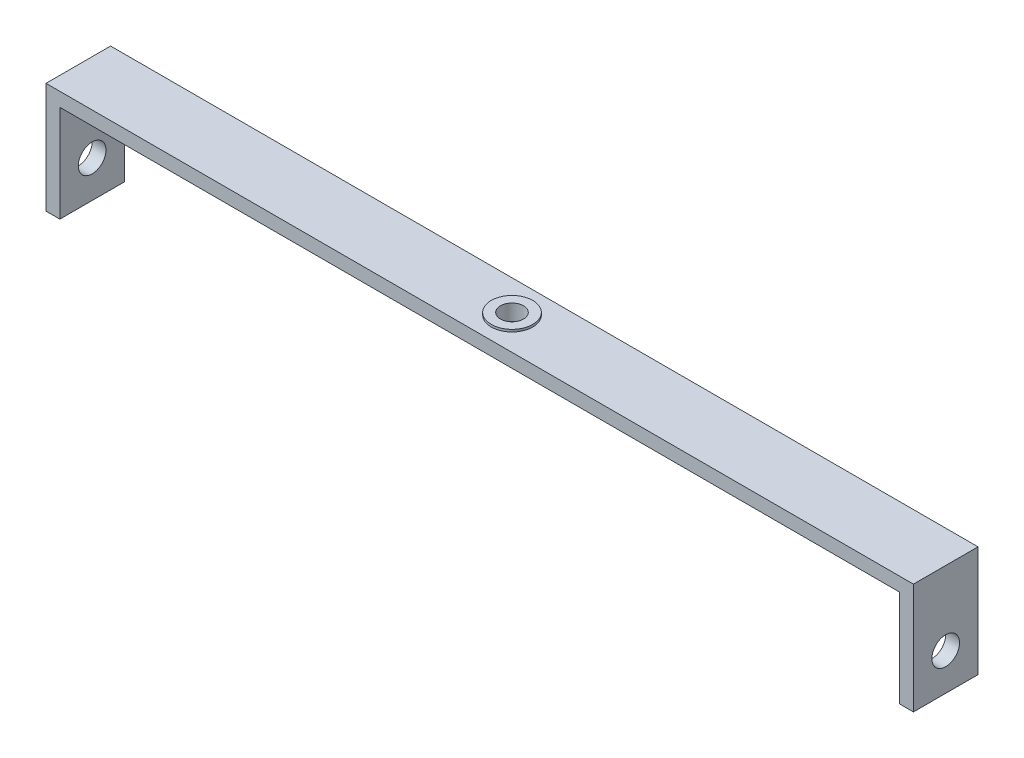
ISO-10303-21;
HEADER;
FILE_DESCRIPTION(('STEP AP214'),'2;1');
FILE_NAME('part.step','',(''),(''),'','','');
FILE_SCHEMA(('AUTOMOTIVE_DESIGN { 1 0 10303 214 1 1 1 1 }'));
ENDSEC;
DATA;
#1=APPLICATION_CONTEXT('core data for automotive mechanical design processes');
#2=APPLICATION_PROTOCOL_DEFINITION('international standard','automotive_design',2000,#1);
#3=PRODUCT_CONTEXT('',#1,'mechanical');
#4=PRODUCT('Part','Part','',(#3));
#5=PRODUCT_RELATED_PRODUCT_CATEGORY('part','',(#4));
#6=PRODUCT_DEFINITION_FORMATION('','',#4);
#7=PRODUCT_DEFINITION_CONTEXT('part definition',#1,'design');
#8=PRODUCT_DEFINITION('design','',#6,#7);
#9=PRODUCT_DEFINITION_SHAPE('','',#8);
#10=(LENGTH_UNIT() NAMED_UNIT(*) SI_UNIT(.MILLI.,.METRE.));
#11=(NAMED_UNIT(*) PLANE_ANGLE_UNIT() SI_UNIT($,.RADIAN.));
#12=(NAMED_UNIT(*) SI_UNIT($,.STERADIAN.) SOLID_ANGLE_UNIT());
#13=UNCERTAINTY_MEASURE_WITH_UNIT(LENGTH_MEASURE(1.E-05),#10,'distance_accuracy_value','');
#14=(GEOMETRIC_REPRESENTATION_CONTEXT(3) GLOBAL_UNCERTAINTY_ASSIGNED_CONTEXT((#13)) GLOBAL_UNIT_ASSIGNED_CONTEXT((#10,
#11,#12)) REPRESENTATION_CONTEXT('',''));
#15=CARTESIAN_POINT('',(0.,0.,0.));
#16=DIRECTION('',(0.,0.,1.));
#17=DIRECTION('',(1.,0.,0.));
#18=AXIS2_PLACEMENT_3D('',#15,#16,#17);
#19=CARTESIAN_POINT('',(-846.000000000001,29.5366942623952,63.));
#20=DIRECTION('',(0.,-1.,0.));
#21=DIRECTION('',(1.,0.,0.));
#22=AXIS2_PLACEMENT_3D('',#19,#20,#21);
#23=PLANE('',#22);
#24=DIRECTION('',(-1.,0.,0.));
#25=VECTOR('',#24,1.);
#26=CARTESIAN_POINT('',(-846.000000000001,29.5366942623952,-63.));
#27=LINE('',#26,#25);
#28=CARTESIAN_POINT('',(845.999999999999,29.5366942623955,-63.));
#29=VERTEX_POINT('',#28);
#30=CARTESIAN_POINT('',(-846.000000000001,29.5366942623952,-63.));
#31=VERTEX_POINT('',#30);
#32=EDGE_CURVE('E89',#29,#31,#27,.T.);
#33=ORIENTED_EDGE('',*,*,#32,.T.);
#34=DIRECTION('',(0.,0.,-1.));
#35=VECTOR('',#34,1.);
#36=CARTESIAN_POINT('',(-846.000000000001,29.5366942623952,63.));
#37=LINE('',#36,#35);
#38=CARTESIAN_POINT('',(-846.000000000001,29.5366942623952,63.));
#39=VERTEX_POINT('',#38);
#40=EDGE_CURVE('E135',#39,#31,#37,.T.);
#41=ORIENTED_EDGE('',*,*,#40,.F.);
#42=DIRECTION('',(-1.,0.,0.));
#43=VECTOR('',#42,1.);
#44=CARTESIAN_POINT('',(-846.000000000001,29.5366942623952,63.));
#45=LINE('',#44,#43);
#46=CARTESIAN_POINT('',(845.999999999999,29.5366942623955,63.));
#47=VERTEX_POINT('',#46);
#48=EDGE_CURVE('E121',#47,#39,#45,.T.);
#49=ORIENTED_EDGE('',*,*,#48,.F.);
#50=DIRECTION('',(0.,0.,-1.));
#51=VECTOR('',#50,1.);
#52=CARTESIAN_POINT('',(845.999999999999,29.5366942623955,63.));
#53=LINE('',#52,#51);
#54=EDGE_CURVE('E129',#47,#29,#53,.T.);
#55=ORIENTED_EDGE('',*,*,#54,.T.);
#56=EDGE_LOOP('',(#33,#41,#49,#55));
#57=FACE_BOUND('',#56,.T.);
#58=CARTESIAN_POINT('',(-1.3087115506199E-12,29.5366942623953,0.));
#59=DIRECTION('',(0.,-1.,0.));
#60=DIRECTION('',(1.,0.,0.));
#61=AXIS2_PLACEMENT_3D('',#58,#59,#60);
#62=CIRCLE('',#61,40.5);
#63=CARTESIAN_POINT('',(40.4999999999987,29.5366942623953,0.));
#64=VERTEX_POINT('',#63);
#65=EDGE_CURVE('E11',#64,#64,#62,.F.);
#66=ORIENTED_EDGE('',*,*,#65,.F.);
#67=EDGE_LOOP('',(#66));
#68=FACE_BOUND('',#67,.T.);
#69=ADVANCED_FACE('F42',(#57,#68),#23,.F.);
#70=CARTESIAN_POINT('',(-846.000000000001,-186.463305737605,63.));
#71=DIRECTION('',(0.,1.,0.));
#72=DIRECTION('',(0.,0.,1.));
#73=AXIS2_PLACEMENT_3D('',#70,#71,#72);
#74=PLANE('',#73);
#75=DIRECTION('',(1.,0.,0.));
#76=VECTOR('',#75,1.);
#77=CARTESIAN_POINT('',(-846.000000000001,-186.463305737605,-63.));
#78=LINE('',#77,#76);
#79=CARTESIAN_POINT('',(-846.000000000001,-186.463305737605,-63.));
#80=VERTEX_POINT('',#79);
#81=CARTESIAN_POINT('',(-819.000000000001,-186.463305737605,-63.));
#82=VERTEX_POINT('',#81);
#83=EDGE_CURVE('E145',#80,#82,#78,.T.);
#84=ORIENTED_EDGE('',*,*,#83,.T.);
#85=DIRECTION('',(0.,0.,-1.));
#86=VECTOR('',#85,1.);
#87=CARTESIAN_POINT('',(-819.000000000001,-186.463305737605,63.));
#88=LINE('',#87,#86);
#89=CARTESIAN_POINT('',(-819.000000000001,-186.463305737605,63.));
#90=VERTEX_POINT('',#89);
#91=EDGE_CURVE('E52',#90,#82,#88,.T.);
#92=ORIENTED_EDGE('',*,*,#91,.F.);
#93=DIRECTION('',(1.,0.,0.));
#94=VECTOR('',#93,1.);
#95=CARTESIAN_POINT('',(-846.000000000001,-186.463305737605,63.));
#96=LINE('',#95,#94);
#97=CARTESIAN_POINT('',(-846.000000000001,-186.463305737605,63.));
#98=VERTEX_POINT('',#97);
#99=EDGE_CURVE('E168',#98,#90,#96,.T.);
#100=ORIENTED_EDGE('',*,*,#99,.F.);
#101=DIRECTION('',(0.,0.,-1.));
#102=VECTOR('',#101,1.);
#103=CARTESIAN_POINT('',(-846.000000000001,-186.463305737605,63.));
#104=LINE('',#103,#102);
#105=EDGE_CURVE('E141',#98,#80,#104,.T.);
#106=ORIENTED_EDGE('',*,*,#105,.T.);
#107=EDGE_LOOP('',(#84,#92,#100,#106));
#108=FACE_BOUND('',#107,.T.);
#109=ADVANCED_FACE('F44',(#108),#74,.F.);
#110=CARTESIAN_POINT('',(-819.000000000001,-186.463305737605,63.));
#111=DIRECTION('',(-1.,0.,0.));
#112=DIRECTION('',(0.,0.,1.));
#113=AXIS2_PLACEMENT_3D('',#110,#111,#112);
#114=PLANE('',#113);
#115=CARTESIAN_POINT('',(-819.000000000001,-114.463305737605,0.));
#116=DIRECTION('',(-1.,0.,0.));
#117=DIRECTION('',(0.,0.,1.));
#118=AXIS2_PLACEMENT_3D('',#115,#116,#117);
#119=CIRCLE('',#118,27.);
#120=CARTESIAN_POINT('',(-819.000000000001,-114.463305737605,27.));
#121=VERTEX_POINT('',#120);
#122=EDGE_CURVE('E228',#121,#121,#119,.T.);
#123=ORIENTED_EDGE('',*,*,#122,.T.);
#124=EDGE_LOOP('',(#123));
#125=FACE_BOUND('',#124,.T.);
#126=DIRECTION('',(0.,1.,0.));
#127=VECTOR('',#126,1.);
#128=CARTESIAN_POINT('',(-819.000000000001,-186.463305737605,-63.));
#129=LINE('',#128,#127);
#130=CARTESIAN_POINT('',(-819.000000000001,2.53669426239516,-63.));
#131=VERTEX_POINT('',#130);
#132=EDGE_CURVE('E149',#82,#131,#129,.T.);
#133=ORIENTED_EDGE('',*,*,#132,.T.);
#134=DIRECTION('',(0.,0.,-1.));
#135=VECTOR('',#134,1.);
#136=CARTESIAN_POINT('',(-819.000000000001,2.53669426239516,63.));
#137=LINE('',#136,#135);
#138=CARTESIAN_POINT('',(-819.000000000001,2.53669426239516,63.));
#139=VERTEX_POINT('',#138);
#140=EDGE_CURVE('E183',#139,#131,#137,.T.);
#141=ORIENTED_EDGE('',*,*,#140,.F.);
#142=DIRECTION('',(0.,1.,0.));
#143=VECTOR('',#142,1.);
#144=CARTESIAN_POINT('',(-819.000000000001,-186.463305737605,63.));
#145=LINE('',#144,#143);
#146=EDGE_CURVE('E104',#90,#139,#145,.T.);
#147=ORIENTED_EDGE('',*,*,#146,.F.);
#148=ORIENTED_EDGE('',*,*,#91,.T.);
#149=EDGE_LOOP('',(#133,#141,#147,#148));
#150=FACE_BOUND('',#149,.T.);
#151=ADVANCED_FACE('F188',(#125,#150),#114,.F.);
#152=CARTESIAN_POINT('',(-819.000000000001,2.53669426239516,63.));
#153=DIRECTION('',(0.,1.,0.));
#154=DIRECTION('',(0.,0.,1.));
#155=AXIS2_PLACEMENT_3D('',#152,#153,#154);
#156=PLANE('',#155);
#157=CARTESIAN_POINT('',(-1.30329675274142E-12,2.53669426239516,0.));
#158=DIRECTION('',(0.,1.,0.));
#159=DIRECTION('',(0.,0.,1.));
#160=AXIS2_PLACEMENT_3D('',#157,#158,#159);
#161=CIRCLE('',#160,22.5);
#162=CARTESIAN_POINT('',(-1.30329675274142E-12,2.53669426239516,22.5));
#163=VERTEX_POINT('',#162);
#164=EDGE_CURVE('E150',#163,#163,#161,.F.);
#165=ORIENTED_EDGE('',*,*,#164,.F.);
#166=EDGE_LOOP('',(#165));
#167=FACE_BOUND('',#166,.T.);
#168=DIRECTION('',(1.,0.,0.));
#169=VECTOR('',#168,1.);
#170=CARTESIAN_POINT('',(-819.000000000001,2.53669426239516,-63.));
#171=LINE('',#170,#169);
#172=CARTESIAN_POINT('',(818.999999999999,2.53669426239516,-63.));
#173=VERTEX_POINT('',#172);
#174=EDGE_CURVE('E153',#131,#173,#171,.T.);
#175=ORIENTED_EDGE('',*,*,#174,.T.);
#176=DIRECTION('',(0.,0.,-1.));
#177=VECTOR('',#176,1.);
#178=CARTESIAN_POINT('',(818.999999999999,2.53669426239516,63.));
#179=LINE('',#178,#177);
#180=CARTESIAN_POINT('',(818.999999999999,2.53669426239516,63.));
#181=VERTEX_POINT('',#180);
#182=EDGE_CURVE('E179',#181,#173,#179,.T.);
#183=ORIENTED_EDGE('',*,*,#182,.F.);
#184=DIRECTION('',(1.,0.,0.));
#185=VECTOR('',#184,1.);
#186=CARTESIAN_POINT('',(-819.000000000001,2.53669426239516,63.));
#187=LINE('',#186,#185);
#188=EDGE_CURVE('E207',#139,#181,#187,.T.);
#189=ORIENTED_EDGE('',*,*,#188,.F.);
#190=ORIENTED_EDGE('',*,*,#140,.T.);
#191=EDGE_LOOP('',(#175,#183,#189,#190));
#192=FACE_BOUND('',#191,.T.);
#193=ADVANCED_FACE('F199',(#167,#192),#156,.F.);
#194=CARTESIAN_POINT('',(818.999999999999,2.53669426239516,63.));
#195=DIRECTION('',(1.,0.,0.));
#196=DIRECTION('',(0.,0.,-1.));
#197=AXIS2_PLACEMENT_3D('',#194,#195,#196);
#198=PLANE('',#197);
#199=CARTESIAN_POINT('',(818.999999999999,-114.463305737605,0.));
#200=DIRECTION('',(1.,0.,0.));
#201=DIRECTION('',(0.,0.,-1.));
#202=AXIS2_PLACEMENT_3D('',#199,#200,#201);
#203=CIRCLE('',#202,27.);
#204=CARTESIAN_POINT('',(818.999999999999,-114.463305737605,-27.));
#205=VERTEX_POINT('',#204);
#206=EDGE_CURVE('E232',#205,#205,#203,.T.);
#207=ORIENTED_EDGE('',*,*,#206,.T.);
#208=EDGE_LOOP('',(#207));
#209=FACE_BOUND('',#208,.T.);
#210=DIRECTION('',(0.,-1.,0.));
#211=VECTOR('',#210,1.);
#212=CARTESIAN_POINT('',(818.999999999999,2.53669426239516,-63.));
#213=LINE('',#212,#211);
#214=CARTESIAN_POINT('',(818.999999999999,-186.463305737605,-63.));
#215=VERTEX_POINT('',#214);
#216=EDGE_CURVE('E156',#173,#215,#213,.T.);
#217=ORIENTED_EDGE('',*,*,#216,.T.);
#218=DIRECTION('',(0.,0.,-1.));
#219=VECTOR('',#218,1.);
#220=CARTESIAN_POINT('',(818.999999999999,-186.463305737605,63.));
#221=LINE('',#220,#219);
#222=CARTESIAN_POINT('',(818.999999999999,-186.463305737605,63.));
#223=VERTEX_POINT('',#222);
#224=EDGE_CURVE('E175',#223,#215,#221,.T.);
#225=ORIENTED_EDGE('',*,*,#224,.F.);
#226=DIRECTION('',(0.,-1.,0.));
#227=VECTOR('',#226,1.);
#228=CARTESIAN_POINT('',(818.999999999999,2.53669426239516,63.));
#229=LINE('',#228,#227);
#230=EDGE_CURVE('E205',#181,#223,#229,.T.);
#231=ORIENTED_EDGE('',*,*,#230,.F.);
#232=ORIENTED_EDGE('',*,*,#182,.T.);
#233=EDGE_LOOP('',(#217,#225,#231,#232));
#234=FACE_BOUND('',#233,.T.);
#235=ADVANCED_FACE('F203',(#209,#234),#198,.F.);
#236=CARTESIAN_POINT('',(818.999999999999,-186.463305737605,63.));
#237=DIRECTION('',(0.,1.,0.));
#238=DIRECTION('',(0.,0.,1.));
#239=AXIS2_PLACEMENT_3D('',#236,#237,#238);
#240=PLANE('',#239);
#241=DIRECTION('',(1.,0.,0.));
#242=VECTOR('',#241,1.);
#243=CARTESIAN_POINT('',(818.999999999999,-186.463305737605,-63.));
#244=LINE('',#243,#242);
#245=CARTESIAN_POINT('',(845.999999999999,-186.463305737605,-63.));
#246=VERTEX_POINT('',#245);
#247=EDGE_CURVE('E159',#215,#246,#244,.T.);
#248=ORIENTED_EDGE('',*,*,#247,.T.);
#249=DIRECTION('',(0.,0.,-1.));
#250=VECTOR('',#249,1.);
#251=CARTESIAN_POINT('',(845.999999999999,-186.463305737605,63.));
#252=LINE('',#251,#250);
#253=CARTESIAN_POINT('',(845.999999999999,-186.463305737605,63.));
#254=VERTEX_POINT('',#253);
#255=EDGE_CURVE('E134',#254,#246,#252,.T.);
#256=ORIENTED_EDGE('',*,*,#255,.F.);
#257=DIRECTION('',(1.,0.,0.));
#258=VECTOR('',#257,1.);
#259=CARTESIAN_POINT('',(818.999999999999,-186.463305737605,63.));
#260=LINE('',#259,#258);
#261=EDGE_CURVE('E123',#223,#254,#260,.T.);
#262=ORIENTED_EDGE('',*,*,#261,.F.);
#263=ORIENTED_EDGE('',*,*,#224,.T.);
#264=EDGE_LOOP('',(#248,#256,#262,#263));
#265=FACE_BOUND('',#264,.T.);
#266=ADVANCED_FACE('F250',(#265),#240,.F.);
#267=CARTESIAN_POINT('',(845.999999999999,29.5366942623955,63.));
#268=DIRECTION('',(-1.,0.,0.));
#269=DIRECTION('',(0.,-1.,0.));
#270=AXIS2_PLACEMENT_3D('',#267,#268,#269);
#271=PLANE('',#270);
#272=CARTESIAN_POINT('',(845.999999999999,-114.463305737605,0.));
#273=DIRECTION('',(1.,0.,0.));
#274=DIRECTION('',(0.,0.,-1.));
#275=AXIS2_PLACEMENT_3D('',#272,#273,#274);
#276=CIRCLE('',#275,27.);
#277=CARTESIAN_POINT('',(845.999999999999,-114.463305737605,-27.));
#278=VERTEX_POINT('',#277);
#279=EDGE_CURVE('E240',#278,#278,#276,.T.);
#280=ORIENTED_EDGE('',*,*,#279,.F.);
#281=EDGE_LOOP('',(#280));
#282=FACE_BOUND('',#281,.T.);
#283=DIRECTION('',(0.,1.,0.));
#284=VECTOR('',#283,1.);
#285=CARTESIAN_POINT('',(845.999999999999,29.5366942623955,-63.));
#286=LINE('',#285,#284);
#287=EDGE_CURVE('E132',#246,#29,#286,.T.);
#288=ORIENTED_EDGE('',*,*,#287,.T.);
#289=ORIENTED_EDGE('',*,*,#54,.F.);
#290=DIRECTION('',(0.,1.,0.));
#291=VECTOR('',#290,1.);
#292=CARTESIAN_POINT('',(845.999999999999,29.5366942623955,63.));
#293=LINE('',#292,#291);
#294=EDGE_CURVE('E117',#254,#47,#293,.T.);
#295=ORIENTED_EDGE('',*,*,#294,.F.);
#296=ORIENTED_EDGE('',*,*,#255,.T.);
#297=EDGE_LOOP('',(#288,#289,#295,#296));
#298=FACE_BOUND('',#297,.T.);
#299=ADVANCED_FACE('F130',(#282,#298),#271,.F.);
#300=CARTESIAN_POINT('',(-846.000000000001,-186.463305737605,63.));
#301=DIRECTION('',(1.,0.,0.));
#302=DIRECTION('',(0.,0.,-1.));
#303=AXIS2_PLACEMENT_3D('',#300,#301,#302);
#304=PLANE('',#303);
#305=CARTESIAN_POINT('',(-846.000000000001,-114.463305737605,0.));
#306=DIRECTION('',(1.,0.,0.));
#307=DIRECTION('',(0.,0.,-1.));
#308=AXIS2_PLACEMENT_3D('',#305,#306,#307);
#309=CIRCLE('',#308,27.);
#310=CARTESIAN_POINT('',(-846.000000000001,-114.463305737605,-27.));
#311=VERTEX_POINT('',#310);
#312=EDGE_CURVE('E236',#311,#311,#309,.T.);
#313=ORIENTED_EDGE('',*,*,#312,.T.);
#314=EDGE_LOOP('',(#313));
#315=FACE_BOUND('',#314,.T.);
#316=DIRECTION('',(0.,-1.,0.));
#317=VECTOR('',#316,1.);
#318=CARTESIAN_POINT('',(-846.000000000001,-186.463305737605,-63.));
#319=LINE('',#318,#317);
#320=EDGE_CURVE('E95',#31,#80,#319,.T.);
#321=ORIENTED_EDGE('',*,*,#320,.T.);
#322=ORIENTED_EDGE('',*,*,#105,.F.);
#323=DIRECTION('',(0.,-1.,0.));
#324=VECTOR('',#323,1.);
#325=CARTESIAN_POINT('',(-846.000000000001,-186.463305737605,63.));
#326=LINE('',#325,#324);
#327=EDGE_CURVE('E60',#39,#98,#326,.T.);
#328=ORIENTED_EDGE('',*,*,#327,.F.);
#329=ORIENTED_EDGE('',*,*,#40,.T.);
#330=EDGE_LOOP('',(#321,#322,#328,#329));
#331=FACE_BOUND('',#330,.T.);
#332=ADVANCED_FACE('F249',(#315,#331),#304,.F.);
#333=CARTESIAN_POINT('',(-1.3087115506199E-12,29.5366942623952,63.));
#334=DIRECTION('',(0.,0.,1.));
#335=DIRECTION('',(1.,0.,0.));
#336=AXIS2_PLACEMENT_3D('',#333,#334,#335);
#337=PLANE('',#336);
#338=ORIENTED_EDGE('',*,*,#99,.T.);
#339=ORIENTED_EDGE('',*,*,#146,.T.);
#340=ORIENTED_EDGE('',*,*,#188,.T.);
#341=ORIENTED_EDGE('',*,*,#230,.T.);
#342=ORIENTED_EDGE('',*,*,#261,.T.);
#343=ORIENTED_EDGE('',*,*,#294,.T.);
#344=ORIENTED_EDGE('',*,*,#48,.T.);
#345=ORIENTED_EDGE('',*,*,#327,.T.);
#346=EDGE_LOOP('',(#338,#339,#340,#341,#342,#343,#344,#345));
#347=FACE_BOUND('',#346,.T.);
#348=ADVANCED_FACE('F119',(#347),#337,.T.);
#349=CARTESIAN_POINT('',(-1.3087115506199E-12,29.5366942623952,-63.));
#350=DIRECTION('',(0.,0.,1.));
#351=DIRECTION('',(1.,0.,0.));
#352=AXIS2_PLACEMENT_3D('',#349,#350,#351);
#353=PLANE('',#352);
#354=ORIENTED_EDGE('',*,*,#83,.F.);
#355=ORIENTED_EDGE('',*,*,#320,.F.);
#356=ORIENTED_EDGE('',*,*,#32,.F.);
#357=ORIENTED_EDGE('',*,*,#287,.F.);
#358=ORIENTED_EDGE('',*,*,#247,.F.);
#359=ORIENTED_EDGE('',*,*,#216,.F.);
#360=ORIENTED_EDGE('',*,*,#174,.F.);
#361=ORIENTED_EDGE('',*,*,#132,.F.);
#362=EDGE_LOOP('',(#354,#355,#356,#357,#358,#359,#360,#361));
#363=FACE_BOUND('',#362,.T.);
#364=ADVANCED_FACE('F193',(#363),#353,.F.);
#365=CARTESIAN_POINT('',(-1.29053395174601E-12,-61.1029160443941,0.));
#366=DIRECTION('',(0.,1.,0.));
#367=DIRECTION('',(-1.,0.,0.));
#368=AXIS2_PLACEMENT_3D('',#365,#366,#367);
#369=CYLINDRICAL_SURFACE('',#368,22.5);
#370=ORIENTED_EDGE('',*,*,#164,.T.);
#371=EDGE_LOOP('',(#370));
#372=FACE_BOUND('',#371,.T.);
#373=CARTESIAN_POINT('',(-1.30961401693298E-12,34.0366942623952,0.));
#374=DIRECTION('',(0.,1.,0.));
#375=DIRECTION('',(-1.,0.,0.));
#376=AXIS2_PLACEMENT_3D('',#373,#374,#375);
#377=CIRCLE('',#376,22.5);
#378=CARTESIAN_POINT('',(-22.5000000000013,34.0366942623952,0.));
#379=VERTEX_POINT('',#378);
#380=EDGE_CURVE('E224',#379,#379,#377,.T.);
#381=ORIENTED_EDGE('',*,*,#380,.T.);
#382=EDGE_LOOP('',(#381));
#383=FACE_BOUND('',#382,.T.);
#384=ADVANCED_FACE('F268',(#372,#383),#369,.F.);
#385=CARTESIAN_POINT('',(-1.30961401693298E-12,34.0366942623952,0.));
#386=DIRECTION('',(0.,-1.,0.));
#387=DIRECTION('',(1.,0.,0.));
#388=AXIS2_PLACEMENT_3D('',#385,#386,#387);
#389=CYLINDRICAL_SURFACE('',#388,40.5);
#390=CARTESIAN_POINT('',(-1.30961401693298E-12,34.0366942623952,0.));
#391=DIRECTION('',(0.,1.,0.));
#392=DIRECTION('',(-1.,0.,0.));
#393=AXIS2_PLACEMENT_3D('',#390,#391,#392);
#394=CIRCLE('',#393,40.5);
#395=CARTESIAN_POINT('',(-40.5000000000013,34.0366942623952,0.));
#396=VERTEX_POINT('',#395);
#397=EDGE_CURVE('E220',#396,#396,#394,.T.);
#398=ORIENTED_EDGE('',*,*,#397,.F.);
#399=EDGE_LOOP('',(#398));
#400=FACE_BOUND('',#399,.T.);
#401=ORIENTED_EDGE('',*,*,#65,.T.);
#402=EDGE_LOOP('',(#401));
#403=FACE_BOUND('',#402,.T.);
#404=ADVANCED_FACE('F273',(#400,#403),#389,.T.);
#405=CARTESIAN_POINT('',(-1.30961401693298E-12,34.0366942623952,0.));
#406=DIRECTION('',(0.,1.,0.));
#407=DIRECTION('',(-1.,0.,0.));
#408=AXIS2_PLACEMENT_3D('',#405,#406,#407);
#409=PLANE('',#408);
#410=ORIENTED_EDGE('',*,*,#397,.T.);
#411=EDGE_LOOP('',(#410));
#412=FACE_BOUND('',#411,.T.);
#413=ORIENTED_EDGE('',*,*,#380,.F.);
#414=EDGE_LOOP('',(#413));
#415=FACE_BOUND('',#414,.T.);
#416=ADVANCED_FACE('F277',(#412,#415),#409,.T.);
#417=CARTESIAN_POINT('',(-846.000000000001,-114.463305737605,0.));
#418=DIRECTION('',(1.,0.,0.));
#419=DIRECTION('',(0.,0.,-1.));
#420=AXIS2_PLACEMENT_3D('',#417,#418,#419);
#421=CYLINDRICAL_SURFACE('',#420,27.);
#422=ORIENTED_EDGE('',*,*,#312,.F.);
#423=EDGE_LOOP('',(#422));
#424=FACE_BOUND('',#423,.T.);
#425=ORIENTED_EDGE('',*,*,#122,.F.);
#426=EDGE_LOOP('',(#425));
#427=FACE_BOUND('',#426,.T.);
#428=ADVANCED_FACE('F281',(#424,#427),#421,.F.);
#429=ORIENTED_EDGE('',*,*,#279,.T.);
#430=EDGE_LOOP('',(#429));
#431=FACE_BOUND('',#430,.T.);
#432=ORIENTED_EDGE('',*,*,#206,.F.);
#433=EDGE_LOOP('',(#432));
#434=FACE_BOUND('',#433,.T.);
#435=ADVANCED_FACE('F245',(#431,#434),#421,.F.);
#436=CLOSED_SHELL('',(#69,#109,#151,#193,#235,#266,#299,#332,#348,#364,#384,#404,#416,#428,#435));
#437=MANIFOLD_SOLID_BREP('B2',#436);
#438=ADVANCED_BREP_SHAPE_REPRESENTATION('',(#18,#437),#14);
#439=SHAPE_DEFINITION_REPRESENTATION(#9,#438);
ENDSEC;
END-ISO-10303-21;
